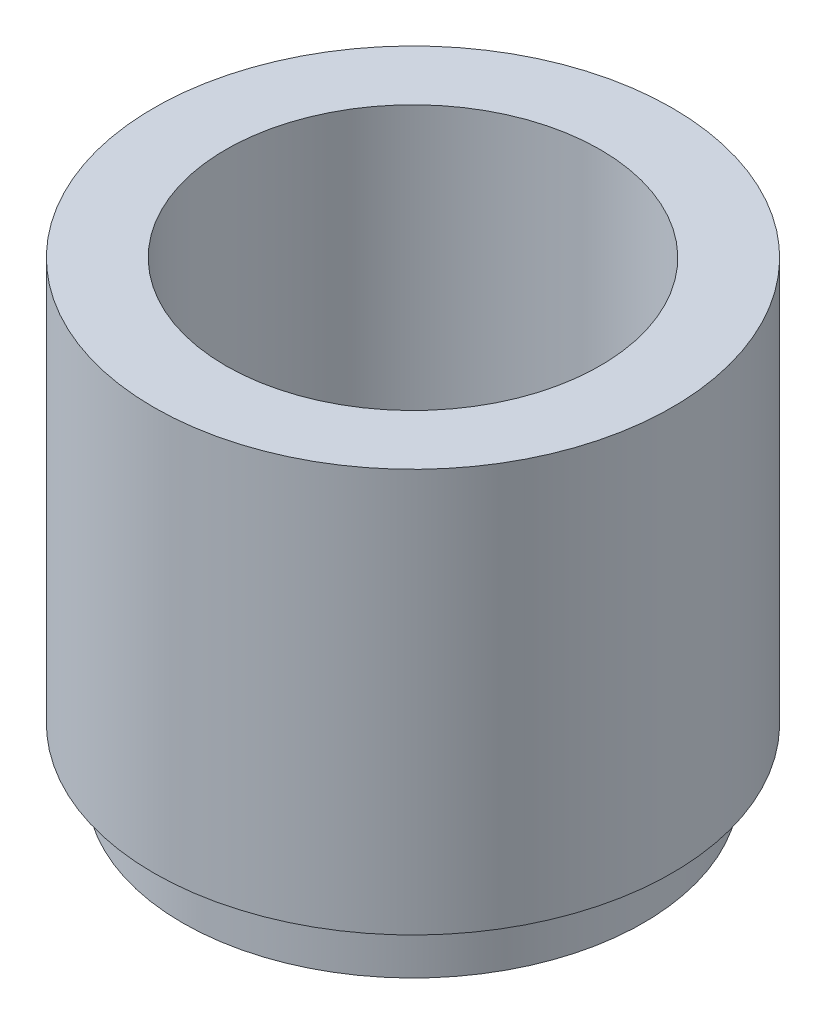
ISO-10303-21;
HEADER;
FILE_DESCRIPTION(('STEP AP214'),'2;1');
FILE_NAME('part.step','',(''),(''),'','','');
FILE_SCHEMA(('AUTOMOTIVE_DESIGN { 1 0 10303 214 1 1 1 1 }'));
ENDSEC;
DATA;
#1=APPLICATION_CONTEXT('core data for automotive mechanical design processes');
#2=APPLICATION_PROTOCOL_DEFINITION('international standard','automotive_design',2000,#1);
#3=PRODUCT_CONTEXT('',#1,'mechanical');
#4=PRODUCT('Part','Part','',(#3));
#5=PRODUCT_RELATED_PRODUCT_CATEGORY('part','',(#4));
#6=PRODUCT_DEFINITION_FORMATION('','',#4);
#7=PRODUCT_DEFINITION_CONTEXT('part definition',#1,'design');
#8=PRODUCT_DEFINITION('design','',#6,#7);
#9=PRODUCT_DEFINITION_SHAPE('','',#8);
#10=(LENGTH_UNIT() NAMED_UNIT(*) SI_UNIT(.MILLI.,.METRE.));
#11=(NAMED_UNIT(*) PLANE_ANGLE_UNIT() SI_UNIT($,.RADIAN.));
#12=(NAMED_UNIT(*) SI_UNIT($,.STERADIAN.) SOLID_ANGLE_UNIT());
#13=UNCERTAINTY_MEASURE_WITH_UNIT(LENGTH_MEASURE(1.E-05),#10,'distance_accuracy_value','');
#14=(GEOMETRIC_REPRESENTATION_CONTEXT(3) GLOBAL_UNCERTAINTY_ASSIGNED_CONTEXT((#13)) GLOBAL_UNIT_ASSIGNED_CONTEXT((#10,
#11,#12)) REPRESENTATION_CONTEXT('',''));
#15=CARTESIAN_POINT('',(0.,0.,0.));
#16=DIRECTION('',(0.,0.,1.));
#17=DIRECTION('',(1.,0.,0.));
#18=AXIS2_PLACEMENT_3D('',#15,#16,#17);
#19=CARTESIAN_POINT('',(0.,80.,0.));
#20=DIRECTION('',(0.,-1.,0.));
#21=DIRECTION('',(0.,0.,-1.));
#22=AXIS2_PLACEMENT_3D('',#19,#20,#21);
#23=CYLINDRICAL_SURFACE('',#22,45.);
#24=CARTESIAN_POINT('',(0.,80.,0.));
#25=DIRECTION('',(0.,1.,0.));
#26=DIRECTION('',(0.,0.,1.));
#27=AXIS2_PLACEMENT_3D('',#24,#25,#26);
#28=CIRCLE('',#27,45.);
#29=CARTESIAN_POINT('',(0.,80.,45.));
#30=VERTEX_POINT('',#29);
#31=EDGE_CURVE('E10',#30,#30,#28,.T.);
#32=ORIENTED_EDGE('',*,*,#31,.F.);
#33=EDGE_LOOP('',(#32));
#34=FACE_BOUND('',#33,.T.);
#35=CARTESIAN_POINT('',(0.,10.,0.));
#36=DIRECTION('',(0.,-1.,0.));
#37=DIRECTION('',(0.,0.,-1.));
#38=AXIS2_PLACEMENT_3D('',#35,#36,#37);
#39=CIRCLE('',#38,45.);
#40=CARTESIAN_POINT('',(0.,10.,-45.));
#41=VERTEX_POINT('',#40);
#42=EDGE_CURVE('E37',#41,#41,#39,.T.);
#43=ORIENTED_EDGE('',*,*,#42,.F.);
#44=EDGE_LOOP('',(#43));
#45=FACE_BOUND('',#44,.T.);
#46=ADVANCED_FACE('F31',(#34,#45),#23,.T.);
#47=CARTESIAN_POINT('',(0.,80.,0.));
#48=DIRECTION('',(0.,1.,0.));
#49=DIRECTION('',(0.,0.,1.));
#50=AXIS2_PLACEMENT_3D('',#47,#48,#49);
#51=PLANE('',#50);
#52=CARTESIAN_POINT('',(0.,80.,0.));
#53=DIRECTION('',(0.,-1.,0.));
#54=DIRECTION('',(0.,0.,-1.));
#55=AXIS2_PLACEMENT_3D('',#52,#53,#54);
#56=CIRCLE('',#55,32.5);
#57=CARTESIAN_POINT('',(0.,80.,-32.5));
#58=VERTEX_POINT('',#57);
#59=EDGE_CURVE('E49',#58,#58,#56,.T.);
#60=ORIENTED_EDGE('',*,*,#59,.T.);
#61=EDGE_LOOP('',(#60));
#62=FACE_BOUND('',#61,.T.);
#63=ORIENTED_EDGE('',*,*,#31,.T.);
#64=EDGE_LOOP('',(#63));
#65=FACE_BOUND('',#64,.T.);
#66=ADVANCED_FACE('F57',(#62,#65),#51,.T.);
#67=CARTESIAN_POINT('',(0.,10.,0.));
#68=DIRECTION('',(0.,-1.,0.));
#69=DIRECTION('',(0.,0.,-1.));
#70=AXIS2_PLACEMENT_3D('',#67,#68,#69);
#71=PLANE('',#70);
#72=CARTESIAN_POINT('',(0.,10.,0.));
#73=DIRECTION('',(0.,-1.,0.));
#74=DIRECTION('',(0.,0.,-1.));
#75=AXIS2_PLACEMENT_3D('',#72,#73,#74);
#76=CIRCLE('',#75,40.);
#77=CARTESIAN_POINT('',(0.,10.,-40.));
#78=VERTEX_POINT('',#77);
#79=EDGE_CURVE('E41',#78,#78,#76,.T.);
#80=ORIENTED_EDGE('',*,*,#79,.F.);
#81=EDGE_LOOP('',(#80));
#82=FACE_BOUND('',#81,.T.);
#83=ORIENTED_EDGE('',*,*,#42,.T.);
#84=EDGE_LOOP('',(#83));
#85=FACE_BOUND('',#84,.T.);
#86=ADVANCED_FACE('F72',(#82,#85),#71,.T.);
#87=CARTESIAN_POINT('',(0.,10.,0.));
#88=DIRECTION('',(0.,-1.,0.));
#89=DIRECTION('',(0.,0.,-1.));
#90=AXIS2_PLACEMENT_3D('',#87,#88,#89);
#91=CYLINDRICAL_SURFACE('',#90,40.);
#92=ORIENTED_EDGE('',*,*,#79,.T.);
#93=EDGE_LOOP('',(#92));
#94=FACE_BOUND('',#93,.T.);
#95=CARTESIAN_POINT('',(0.,0.,0.));
#96=DIRECTION('',(0.,-1.,0.));
#97=DIRECTION('',(0.,0.,-1.));
#98=AXIS2_PLACEMENT_3D('',#95,#96,#97);
#99=CIRCLE('',#98,40.);
#100=CARTESIAN_POINT('',(0.,0.,-40.));
#101=VERTEX_POINT('',#100);
#102=EDGE_CURVE('E45',#101,#101,#99,.T.);
#103=ORIENTED_EDGE('',*,*,#102,.F.);
#104=EDGE_LOOP('',(#103));
#105=FACE_BOUND('',#104,.T.);
#106=ADVANCED_FACE('F68',(#94,#105),#91,.T.);
#107=CARTESIAN_POINT('',(0.,0.,0.));
#108=DIRECTION('',(0.,1.,0.));
#109=DIRECTION('',(0.,0.,1.));
#110=AXIS2_PLACEMENT_3D('',#107,#108,#109);
#111=PLANE('',#110);
#112=CARTESIAN_POINT('',(0.,0.,0.));
#113=DIRECTION('',(0.,-1.,0.));
#114=DIRECTION('',(0.,0.,-1.));
#115=AXIS2_PLACEMENT_3D('',#112,#113,#114);
#116=CIRCLE('',#115,32.5);
#117=CARTESIAN_POINT('',(0.,0.,-32.5));
#118=VERTEX_POINT('',#117);
#119=EDGE_CURVE('E51',#118,#118,#116,.T.);
#120=ORIENTED_EDGE('',*,*,#119,.F.);
#121=EDGE_LOOP('',(#120));
#122=FACE_BOUND('',#121,.T.);
#123=ORIENTED_EDGE('',*,*,#102,.T.);
#124=EDGE_LOOP('',(#123));
#125=FACE_BOUND('',#124,.T.);
#126=ADVANCED_FACE('F62',(#122,#125),#111,.F.);
#127=CARTESIAN_POINT('',(0.,80.,0.));
#128=DIRECTION('',(0.,-1.,0.));
#129=DIRECTION('',(0.,0.,-1.));
#130=AXIS2_PLACEMENT_3D('',#127,#128,#129);
#131=CYLINDRICAL_SURFACE('',#130,32.5);
#132=ORIENTED_EDGE('',*,*,#59,.F.);
#133=EDGE_LOOP('',(#132));
#134=FACE_BOUND('',#133,.T.);
#135=ORIENTED_EDGE('',*,*,#119,.T.);
#136=EDGE_LOOP('',(#135));
#137=FACE_BOUND('',#136,.T.);
#138=ADVANCED_FACE('F59',(#134,#137),#131,.F.);
#139=CLOSED_SHELL('',(#46,#66,#86,#106,#126,#138));
#140=MANIFOLD_SOLID_BREP('B2',#139);
#141=ADVANCED_BREP_SHAPE_REPRESENTATION('',(#18,#140),#14);
#142=SHAPE_DEFINITION_REPRESENTATION(#9,#141);
ENDSEC;
END-ISO-10303-21;
